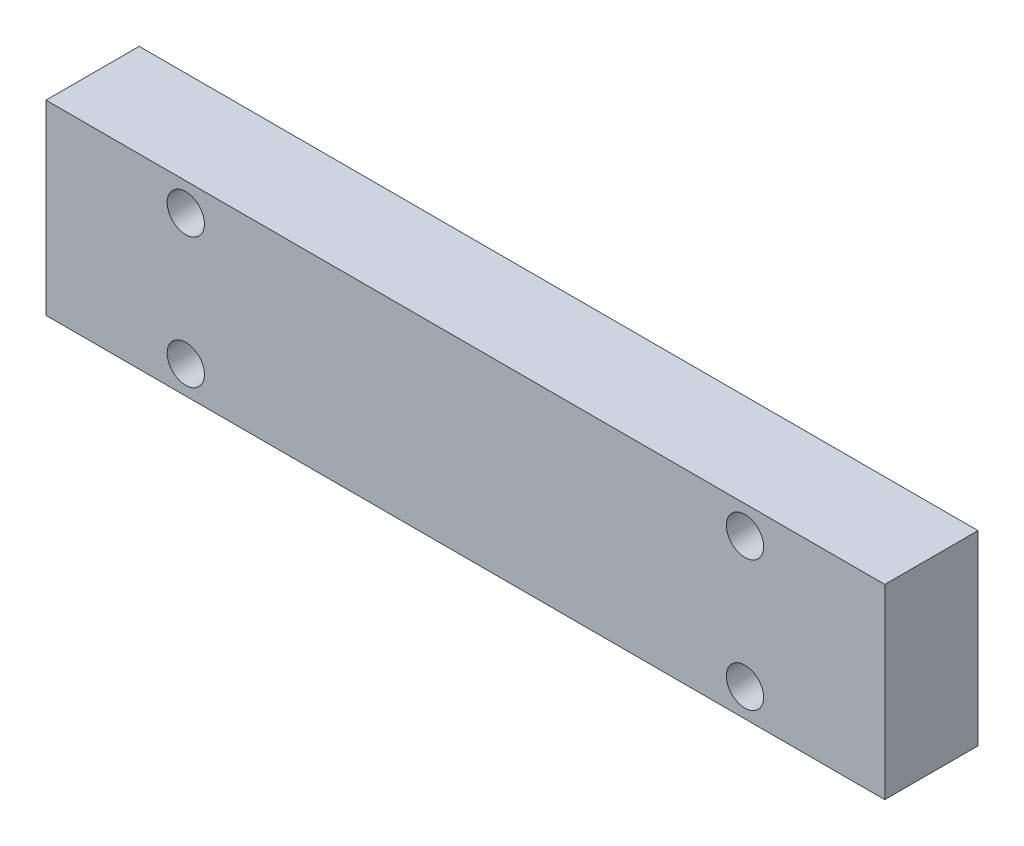
ISO-10303-21;
HEADER;
FILE_DESCRIPTION(('STEP AP214'),'2;1');
FILE_NAME('part.step','',(''),(''),'','','');
FILE_SCHEMA(('AUTOMOTIVE_DESIGN { 1 0 10303 214 1 1 1 1 }'));
ENDSEC;
DATA;
#1=APPLICATION_CONTEXT('core data for automotive mechanical design processes');
#2=APPLICATION_PROTOCOL_DEFINITION('international standard','automotive_design',2000,#1);
#3=PRODUCT_CONTEXT('',#1,'mechanical');
#4=PRODUCT('Part','Part','',(#3));
#5=PRODUCT_RELATED_PRODUCT_CATEGORY('part','',(#4));
#6=PRODUCT_DEFINITION_FORMATION('','',#4);
#7=PRODUCT_DEFINITION_CONTEXT('part definition',#1,'design');
#8=PRODUCT_DEFINITION('design','',#6,#7);
#9=PRODUCT_DEFINITION_SHAPE('','',#8);
#10=(LENGTH_UNIT() NAMED_UNIT(*) SI_UNIT(.MILLI.,.METRE.));
#11=(NAMED_UNIT(*) PLANE_ANGLE_UNIT() SI_UNIT($,.RADIAN.));
#12=(NAMED_UNIT(*) SI_UNIT($,.STERADIAN.) SOLID_ANGLE_UNIT());
#13=UNCERTAINTY_MEASURE_WITH_UNIT(LENGTH_MEASURE(1.E-05),#10,'distance_accuracy_value','');
#14=(GEOMETRIC_REPRESENTATION_CONTEXT(3) GLOBAL_UNCERTAINTY_ASSIGNED_CONTEXT((#13)) GLOBAL_UNIT_ASSIGNED_CONTEXT((#10,
#11,#12)) REPRESENTATION_CONTEXT('',''));
#15=CARTESIAN_POINT('',(0.,0.,0.));
#16=DIRECTION('',(0.,0.,1.));
#17=DIRECTION('',(1.,0.,0.));
#18=AXIS2_PLACEMENT_3D('',#15,#16,#17);
#19=CARTESIAN_POINT('',(-61.2841574649232,27.9464467005076,10.));
#20=DIRECTION('',(1.,0.,0.));
#21=DIRECTION('',(0.,0.,-1.));
#22=AXIS2_PLACEMENT_3D('',#19,#20,#21);
#23=PLANE('',#22);
#24=DIRECTION('',(0.,-1.,0.));
#25=VECTOR('',#24,1.);
#26=CARTESIAN_POINT('',(-61.2841574649232,27.9464467005076,0.));
#27=LINE('',#26,#25);
#28=CARTESIAN_POINT('',(-61.2841574649232,27.9464467005076,0.));
#29=VERTEX_POINT('',#28);
#30=CARTESIAN_POINT('',(-61.2841574649232,7.94644670050762,0.));
#31=VERTEX_POINT('',#30);
#32=EDGE_CURVE('E96',#29,#31,#27,.T.);
#33=ORIENTED_EDGE('',*,*,#32,.T.);
#34=DIRECTION('',(0.,0.,-1.));
#35=VECTOR('',#34,1.);
#36=CARTESIAN_POINT('',(-61.2841574649232,7.94644670050762,10.));
#37=LINE('',#36,#35);
#38=CARTESIAN_POINT('',(-61.2841574649232,7.94644670050762,10.));
#39=VERTEX_POINT('',#38);
#40=EDGE_CURVE('E11',#39,#31,#37,.T.);
#41=ORIENTED_EDGE('',*,*,#40,.F.);
#42=DIRECTION('',(0.,-1.,0.));
#43=VECTOR('',#42,1.);
#44=CARTESIAN_POINT('',(-61.2841574649232,27.9464467005076,10.));
#45=LINE('',#44,#43);
#46=CARTESIAN_POINT('',(-61.2841574649232,27.9464467005076,10.));
#47=VERTEX_POINT('',#46);
#48=EDGE_CURVE('E84',#47,#39,#45,.T.);
#49=ORIENTED_EDGE('',*,*,#48,.F.);
#50=DIRECTION('',(0.,0.,-1.));
#51=VECTOR('',#50,1.);
#52=CARTESIAN_POINT('',(-61.2841574649232,27.9464467005076,10.));
#53=LINE('',#52,#51);
#54=EDGE_CURVE('E92',#47,#29,#53,.T.);
#55=ORIENTED_EDGE('',*,*,#54,.T.);
#56=EDGE_LOOP('',(#33,#41,#49,#55));
#57=FACE_BOUND('',#56,.T.);
#58=ADVANCED_FACE('F33',(#57),#23,.F.);
#59=CARTESIAN_POINT('',(-61.2841574649232,7.94644670050762,10.));
#60=DIRECTION('',(0.,1.,0.));
#61=DIRECTION('',(0.,0.,1.));
#62=AXIS2_PLACEMENT_3D('',#59,#60,#61);
#63=PLANE('',#62);
#64=DIRECTION('',(1.,0.,0.));
#65=VECTOR('',#64,1.);
#66=CARTESIAN_POINT('',(-61.2841574649232,7.94644670050762,0.));
#67=LINE('',#66,#65);
#68=CARTESIAN_POINT('',(28.7158425350768,7.94644670050762,0.));
#69=VERTEX_POINT('',#68);
#70=EDGE_CURVE('E88',#31,#69,#67,.T.);
#71=ORIENTED_EDGE('',*,*,#70,.T.);
#72=DIRECTION('',(0.,0.,-1.));
#73=VECTOR('',#72,1.);
#74=CARTESIAN_POINT('',(28.7158425350768,7.94644670050762,10.));
#75=LINE('',#74,#73);
#76=CARTESIAN_POINT('',(28.7158425350768,7.94644670050762,10.));
#77=VERTEX_POINT('',#76);
#78=EDGE_CURVE('E41',#77,#69,#75,.T.);
#79=ORIENTED_EDGE('',*,*,#78,.F.);
#80=DIRECTION('',(1.,0.,0.));
#81=VECTOR('',#80,1.);
#82=CARTESIAN_POINT('',(-61.2841574649232,7.94644670050762,10.));
#83=LINE('',#82,#81);
#84=EDGE_CURVE('E79',#39,#77,#83,.T.);
#85=ORIENTED_EDGE('',*,*,#84,.F.);
#86=ORIENTED_EDGE('',*,*,#40,.T.);
#87=EDGE_LOOP('',(#71,#79,#85,#86));
#88=FACE_BOUND('',#87,.T.);
#89=ADVANCED_FACE('F87',(#88),#63,.F.);
#90=CARTESIAN_POINT('',(28.7158425350768,27.9464467005076,10.));
#91=DIRECTION('',(-1.,0.,0.));
#92=DIRECTION('',(0.,-1.,0.));
#93=AXIS2_PLACEMENT_3D('',#90,#91,#92);
#94=PLANE('',#93);
#95=DIRECTION('',(0.,1.,0.));
#96=VECTOR('',#95,1.);
#97=CARTESIAN_POINT('',(28.7158425350768,27.9464467005076,0.));
#98=LINE('',#97,#96);
#99=CARTESIAN_POINT('',(28.7158425350768,27.9464467005076,0.));
#100=VERTEX_POINT('',#99);
#101=EDGE_CURVE('E66',#69,#100,#98,.T.);
#102=ORIENTED_EDGE('',*,*,#101,.T.);
#103=DIRECTION('',(0.,0.,-1.));
#104=VECTOR('',#103,1.);
#105=CARTESIAN_POINT('',(28.7158425350768,27.9464467005076,10.));
#106=LINE('',#105,#104);
#107=CARTESIAN_POINT('',(28.7158425350768,27.9464467005076,10.));
#108=VERTEX_POINT('',#107);
#109=EDGE_CURVE('E89',#108,#100,#106,.T.);
#110=ORIENTED_EDGE('',*,*,#109,.F.);
#111=DIRECTION('',(0.,1.,0.));
#112=VECTOR('',#111,1.);
#113=CARTESIAN_POINT('',(28.7158425350768,27.9464467005076,10.));
#114=LINE('',#113,#112);
#115=EDGE_CURVE('E82',#77,#108,#114,.T.);
#116=ORIENTED_EDGE('',*,*,#115,.F.);
#117=ORIENTED_EDGE('',*,*,#78,.T.);
#118=EDGE_LOOP('',(#102,#110,#116,#117));
#119=FACE_BOUND('',#118,.T.);
#120=ADVANCED_FACE('F90',(#119),#94,.F.);
#121=CARTESIAN_POINT('',(-61.2841574649232,27.9464467005076,10.));
#122=DIRECTION('',(0.,-1.,0.));
#123=DIRECTION('',(0.,0.,-1.));
#124=AXIS2_PLACEMENT_3D('',#121,#122,#123);
#125=PLANE('',#124);
#126=DIRECTION('',(-1.,0.,0.));
#127=VECTOR('',#126,1.);
#128=CARTESIAN_POINT('',(-61.2841574649232,27.9464467005076,0.));
#129=LINE('',#128,#127);
#130=EDGE_CURVE('E72',#100,#29,#129,.T.);
#131=ORIENTED_EDGE('',*,*,#130,.T.);
#132=ORIENTED_EDGE('',*,*,#54,.F.);
#133=DIRECTION('',(-1.,0.,0.));
#134=VECTOR('',#133,1.);
#135=CARTESIAN_POINT('',(-61.2841574649232,27.9464467005076,10.));
#136=LINE('',#135,#134);
#137=EDGE_CURVE('E49',#108,#47,#136,.T.);
#138=ORIENTED_EDGE('',*,*,#137,.F.);
#139=ORIENTED_EDGE('',*,*,#109,.T.);
#140=EDGE_LOOP('',(#131,#132,#138,#139));
#141=FACE_BOUND('',#140,.T.);
#142=ADVANCED_FACE('F104',(#141),#125,.F.);
#143=CARTESIAN_POINT('',(0.,0.,10.));
#144=DIRECTION('',(0.,0.,1.));
#145=DIRECTION('',(1.,0.,0.));
#146=AXIS2_PLACEMENT_3D('',#143,#144,#145);
#147=PLANE('',#146);
#148=CARTESIAN_POINT('',(-46.2841574649232,24.9464467005076,9.99999999999999));
#149=DIRECTION('',(0.,0.,1.));
#150=DIRECTION('',(1.,0.,0.));
#151=AXIS2_PLACEMENT_3D('',#148,#149,#150);
#152=CIRCLE('',#151,2.);
#153=CARTESIAN_POINT('',(-44.2841574649232,24.9464467005076,9.99999999999999));
#154=VERTEX_POINT('',#153);
#155=EDGE_CURVE('E127',#154,#154,#152,.T.);
#156=ORIENTED_EDGE('',*,*,#155,.F.);
#157=EDGE_LOOP('',(#156));
#158=FACE_BOUND('',#157,.T.);
#159=CARTESIAN_POINT('',(-46.2841574649232,10.9464467005076,9.99999999999999));
#160=DIRECTION('',(0.,0.,1.));
#161=DIRECTION('',(1.,0.,0.));
#162=AXIS2_PLACEMENT_3D('',#159,#160,#161);
#163=CIRCLE('',#162,2.);
#164=CARTESIAN_POINT('',(-44.2841574649232,10.9464467005076,9.99999999999999));
#165=VERTEX_POINT('',#164);
#166=EDGE_CURVE('E121',#165,#165,#163,.T.);
#167=ORIENTED_EDGE('',*,*,#166,.F.);
#168=EDGE_LOOP('',(#167));
#169=FACE_BOUND('',#168,.T.);
#170=CARTESIAN_POINT('',(13.7158425350768,10.9464467005076,9.99999999999999));
#171=DIRECTION('',(0.,0.,1.));
#172=DIRECTION('',(1.,0.,0.));
#173=AXIS2_PLACEMENT_3D('',#170,#171,#172);
#174=CIRCLE('',#173,2.);
#175=CARTESIAN_POINT('',(15.7158425350768,10.9464467005076,9.99999999999999));
#176=VERTEX_POINT('',#175);
#177=EDGE_CURVE('E115',#176,#176,#174,.T.);
#178=ORIENTED_EDGE('',*,*,#177,.F.);
#179=EDGE_LOOP('',(#178));
#180=FACE_BOUND('',#179,.T.);
#181=CARTESIAN_POINT('',(13.7158425350768,24.9464467005076,9.99999999999999));
#182=DIRECTION('',(0.,0.,1.));
#183=DIRECTION('',(1.,0.,0.));
#184=AXIS2_PLACEMENT_3D('',#181,#182,#183);
#185=CIRCLE('',#184,2.);
#186=CARTESIAN_POINT('',(15.7158425350768,24.9464467005076,9.99999999999999));
#187=VERTEX_POINT('',#186);
#188=EDGE_CURVE('E99',#187,#187,#185,.T.);
#189=ORIENTED_EDGE('',*,*,#188,.F.);
#190=EDGE_LOOP('',(#189));
#191=FACE_BOUND('',#190,.T.);
#192=ORIENTED_EDGE('',*,*,#48,.T.);
#193=ORIENTED_EDGE('',*,*,#84,.T.);
#194=ORIENTED_EDGE('',*,*,#115,.T.);
#195=ORIENTED_EDGE('',*,*,#137,.T.);
#196=EDGE_LOOP('',(#192,#193,#194,#195));
#197=FACE_BOUND('',#196,.T.);
#198=ADVANCED_FACE('F80',(#158,#169,#180,#191,#197),#147,.T.);
#199=CARTESIAN_POINT('',(0.,0.,0.));
#200=DIRECTION('',(0.,0.,1.));
#201=DIRECTION('',(1.,0.,0.));
#202=AXIS2_PLACEMENT_3D('',#199,#200,#201);
#203=PLANE('',#202);
#204=CARTESIAN_POINT('',(-46.2841574649232,24.9464467005076,0.));
#205=DIRECTION('',(0.,0.,-1.));
#206=DIRECTION('',(1.,0.,0.));
#207=AXIS2_PLACEMENT_3D('',#204,#205,#206);
#208=CIRCLE('',#207,2.);
#209=CARTESIAN_POINT('',(-44.2841574649232,24.9464467005076,0.));
#210=VERTEX_POINT('',#209);
#211=EDGE_CURVE('E130',#210,#210,#208,.T.);
#212=ORIENTED_EDGE('',*,*,#211,.F.);
#213=EDGE_LOOP('',(#212));
#214=FACE_BOUND('',#213,.T.);
#215=CARTESIAN_POINT('',(-46.2841574649232,10.9464467005076,0.));
#216=DIRECTION('',(0.,0.,-1.));
#217=DIRECTION('',(1.,0.,0.));
#218=AXIS2_PLACEMENT_3D('',#215,#216,#217);
#219=CIRCLE('',#218,2.);
#220=CARTESIAN_POINT('',(-44.2841574649232,10.9464467005076,0.));
#221=VERTEX_POINT('',#220);
#222=EDGE_CURVE('E124',#221,#221,#219,.T.);
#223=ORIENTED_EDGE('',*,*,#222,.F.);
#224=EDGE_LOOP('',(#223));
#225=FACE_BOUND('',#224,.T.);
#226=CARTESIAN_POINT('',(13.7158425350768,10.9464467005076,0.));
#227=DIRECTION('',(0.,0.,-1.));
#228=DIRECTION('',(-1.,0.,0.));
#229=AXIS2_PLACEMENT_3D('',#226,#227,#228);
#230=CIRCLE('',#229,2.);
#231=CARTESIAN_POINT('',(11.7158425350768,10.9464467005076,0.));
#232=VERTEX_POINT('',#231);
#233=EDGE_CURVE('E118',#232,#232,#230,.T.);
#234=ORIENTED_EDGE('',*,*,#233,.F.);
#235=EDGE_LOOP('',(#234));
#236=FACE_BOUND('',#235,.T.);
#237=CARTESIAN_POINT('',(13.7158425350768,24.9464467005076,0.));
#238=DIRECTION('',(0.,0.,-1.));
#239=DIRECTION('',(-1.,0.,0.));
#240=AXIS2_PLACEMENT_3D('',#237,#238,#239);
#241=CIRCLE('',#240,2.);
#242=CARTESIAN_POINT('',(11.7158425350768,24.9464467005076,0.));
#243=VERTEX_POINT('',#242);
#244=EDGE_CURVE('E112',#243,#243,#241,.T.);
#245=ORIENTED_EDGE('',*,*,#244,.F.);
#246=EDGE_LOOP('',(#245));
#247=FACE_BOUND('',#246,.T.);
#248=ORIENTED_EDGE('',*,*,#32,.F.);
#249=ORIENTED_EDGE('',*,*,#130,.F.);
#250=ORIENTED_EDGE('',*,*,#101,.F.);
#251=ORIENTED_EDGE('',*,*,#70,.F.);
#252=EDGE_LOOP('',(#248,#249,#250,#251));
#253=FACE_BOUND('',#252,.T.);
#254=ADVANCED_FACE('F107',(#214,#225,#236,#247,#253),#203,.F.);
#255=CARTESIAN_POINT('',(13.7158425350768,24.9464467005076,94.));
#256=DIRECTION('',(0.,0.,-1.));
#257=DIRECTION('',(-1.,0.,0.));
#258=AXIS2_PLACEMENT_3D('',#255,#256,#257);
#259=CYLINDRICAL_SURFACE('',#258,2.);
#260=ORIENTED_EDGE('',*,*,#188,.T.);
#261=EDGE_LOOP('',(#260));
#262=FACE_BOUND('',#261,.T.);
#263=ORIENTED_EDGE('',*,*,#244,.T.);
#264=EDGE_LOOP('',(#263));
#265=FACE_BOUND('',#264,.T.);
#266=ADVANCED_FACE('F138',(#262,#265),#259,.F.);
#267=CARTESIAN_POINT('',(13.7158425350768,10.9464467005076,94.));
#268=DIRECTION('',(0.,0.,-1.));
#269=DIRECTION('',(-1.,0.,0.));
#270=AXIS2_PLACEMENT_3D('',#267,#268,#269);
#271=CYLINDRICAL_SURFACE('',#270,2.);
#272=ORIENTED_EDGE('',*,*,#177,.T.);
#273=EDGE_LOOP('',(#272));
#274=FACE_BOUND('',#273,.T.);
#275=ORIENTED_EDGE('',*,*,#233,.T.);
#276=EDGE_LOOP('',(#275));
#277=FACE_BOUND('',#276,.T.);
#278=ADVANCED_FACE('F147',(#274,#277),#271,.F.);
#279=CARTESIAN_POINT('',(-46.2841574649232,10.9464467005076,94.));
#280=DIRECTION('',(0.,0.,-1.));
#281=DIRECTION('',(-1.,0.,0.));
#282=AXIS2_PLACEMENT_3D('',#279,#280,#281);
#283=CYLINDRICAL_SURFACE('',#282,2.);
#284=ORIENTED_EDGE('',*,*,#166,.T.);
#285=EDGE_LOOP('',(#284));
#286=FACE_BOUND('',#285,.T.);
#287=ORIENTED_EDGE('',*,*,#222,.T.);
#288=EDGE_LOOP('',(#287));
#289=FACE_BOUND('',#288,.T.);
#290=ADVANCED_FACE('F153',(#286,#289),#283,.F.);
#291=CARTESIAN_POINT('',(-46.2841574649232,24.9464467005076,94.));
#292=DIRECTION('',(0.,0.,-1.));
#293=DIRECTION('',(-1.,0.,0.));
#294=AXIS2_PLACEMENT_3D('',#291,#292,#293);
#295=CYLINDRICAL_SURFACE('',#294,2.);
#296=ORIENTED_EDGE('',*,*,#155,.T.);
#297=EDGE_LOOP('',(#296));
#298=FACE_BOUND('',#297,.T.);
#299=ORIENTED_EDGE('',*,*,#211,.T.);
#300=EDGE_LOOP('',(#299));
#301=FACE_BOUND('',#300,.T.);
#302=ADVANCED_FACE('F134',(#298,#301),#295,.F.);
#303=CLOSED_SHELL('',(#58,#89,#120,#142,#198,#254,#266,#278,#290,#302));
#304=MANIFOLD_SOLID_BREP('B2',#303);
#305=ADVANCED_BREP_SHAPE_REPRESENTATION('',(#18,#304),#14);
#306=SHAPE_DEFINITION_REPRESENTATION(#9,#305);
ENDSEC;
END-ISO-10303-21;
